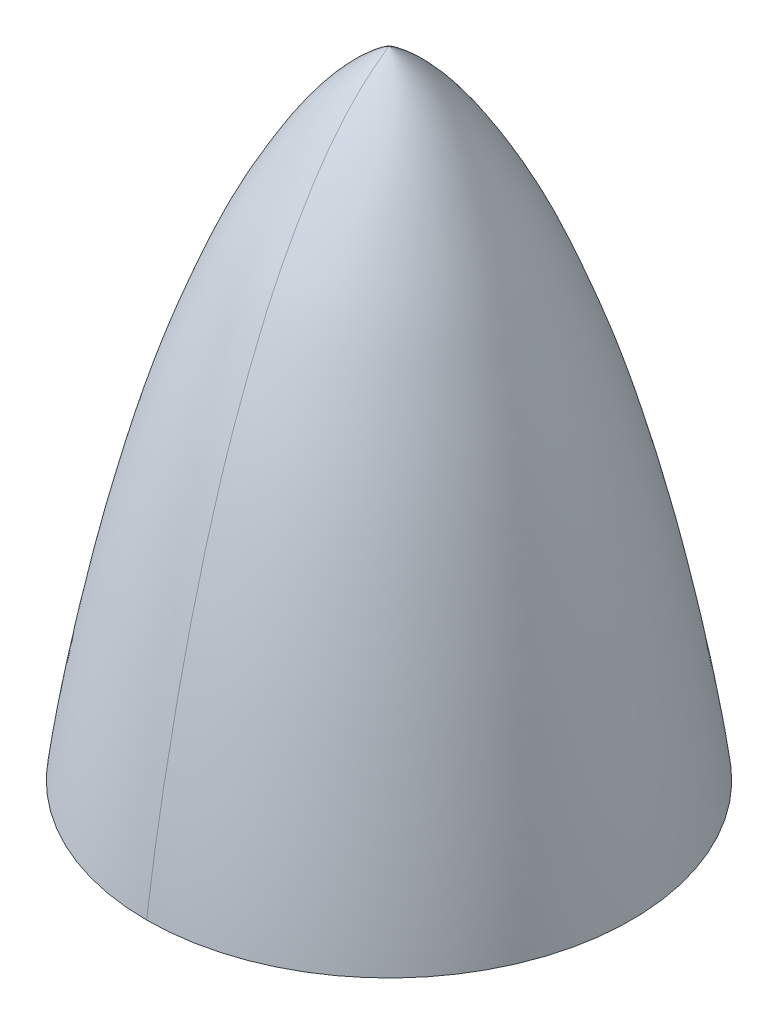
ISO-10303-21;
HEADER;
FILE_DESCRIPTION(('STEP AP214'),'2;1');
FILE_NAME('part.step','',(''),(''),'','','');
FILE_SCHEMA(('AUTOMOTIVE_DESIGN { 1 0 10303 214 1 1 1 1 }'));
ENDSEC;
DATA;
#1=APPLICATION_CONTEXT('core data for automotive mechanical design processes');
#2=APPLICATION_PROTOCOL_DEFINITION('international standard','automotive_design',2000,#1);
#3=PRODUCT_CONTEXT('',#1,'mechanical');
#4=PRODUCT('Part','Part','',(#3));
#5=PRODUCT_RELATED_PRODUCT_CATEGORY('part','',(#4));
#6=PRODUCT_DEFINITION_FORMATION('','',#4);
#7=PRODUCT_DEFINITION_CONTEXT('part definition',#1,'design');
#8=PRODUCT_DEFINITION('design','',#6,#7);
#9=PRODUCT_DEFINITION_SHAPE('','',#8);
#10=(LENGTH_UNIT() NAMED_UNIT(*) SI_UNIT(.MILLI.,.METRE.));
#11=(NAMED_UNIT(*) PLANE_ANGLE_UNIT() SI_UNIT($,.RADIAN.));
#12=(NAMED_UNIT(*) SI_UNIT($,.STERADIAN.) SOLID_ANGLE_UNIT());
#13=UNCERTAINTY_MEASURE_WITH_UNIT(LENGTH_MEASURE(1.E-05),#10,'distance_accuracy_value','');
#14=(GEOMETRIC_REPRESENTATION_CONTEXT(3) GLOBAL_UNCERTAINTY_ASSIGNED_CONTEXT((#13)) GLOBAL_UNIT_ASSIGNED_CONTEXT((#10,
#11,#12)) REPRESENTATION_CONTEXT('',''));
#15=CARTESIAN_POINT('',(0.,0.,0.));
#16=DIRECTION('',(0.,0.,1.));
#17=DIRECTION('',(1.,0.,0.));
#18=AXIS2_PLACEMENT_3D('',#15,#16,#17);
#19=CARTESIAN_POINT('',(0.,663.741999856662,41.2749977111817));
#20=DIRECTION('',(0.,1.,0.));
#21=DIRECTION('',(0.,0.,1.));
#22=AXIS2_PLACEMENT_3D('',#19,#20,#21);
#23=CONICAL_SURFACE('',#22,39.3699932322272,1.57020997915151);
#24=DIRECTION('',(0.,0.000586347609787604,-0.999999828098226));
#25=VECTOR('',#24,1.);
#26=CARTESIAN_POINT('',(0.,663.741999856662,1.90500447895451));
#27=LINE('',#26,#25);
#28=CARTESIAN_POINT('',(0.,663.718915351265,41.2749977111817));
#29=VERTEX_POINT('',#28);
#30=CARTESIAN_POINT('',(0.,663.741999856662,1.90500447895451));
#31=VERTEX_POINT('',#30);
#32=EDGE_CURVE('E32',#29,#31,#27,.T.);
#33=ORIENTED_EDGE('',*,*,#32,.F.);
#34=DIRECTION('',(0.,0.000586347609787604,0.999999828098226));
#35=VECTOR('',#34,1.);
#36=CARTESIAN_POINT('',(0.,663.741999856662,80.6449909434088));
#37=LINE('',#36,#35);
#38=CARTESIAN_POINT('',(0.,663.741999856662,80.6449909434088));
#39=VERTEX_POINT('',#38);
#40=EDGE_CURVE('E61',#29,#39,#37,.T.);
#41=ORIENTED_EDGE('',*,*,#40,.T.);
#42=CARTESIAN_POINT('',(0.,663.741999856662,41.2749977111817));
#43=DIRECTION('',(0.,-1.,0.));
#44=DIRECTION('',(0.,0.,-1.));
#45=AXIS2_PLACEMENT_3D('',#42,#43,#44);
#46=CIRCLE('',#45,39.3699932322272);
#47=EDGE_CURVE('E11',#39,#31,#46,.T.);
#48=ORIENTED_EDGE('',*,*,#47,.T.);
#49=EDGE_LOOP('',(#33,#41,#48));
#50=FACE_BOUND('',#49,.T.);
#51=ADVANCED_FACE('F17',(#50),#23,.T.);
#52=CARTESIAN_POINT('',(0.,663.741999856662,80.6449909434088));
#53=CARTESIAN_POINT('',(-78.7399864644542,663.741999856662,80.6449909434087));
#54=CARTESIAN_POINT('',(-78.7399864644542,663.741999856662,1.90500447895454));
#55=CARTESIAN_POINT('',(0.,663.741999856662,1.90500447895453));
#56=CARTESIAN_POINT('',(0.,672.274081846555,79.5495150284655));
#57=CARTESIAN_POINT('',(-76.5490346345678,672.274081846555,79.5495150284656));
#58=CARTESIAN_POINT('',(-76.5490346345678,672.274081846555,3.00048039389775));
#59=CARTESIAN_POINT('',(0.,672.274081846555,3.00048039389775));
#60=CARTESIAN_POINT('',(0.,683.715125997957,77.4705304733822));
#61=CARTESIAN_POINT('',(-72.391065524401,683.715125997957,77.4705304733822));
#62=CARTESIAN_POINT('',(-72.391065524401,683.715125997957,5.0794649489811));
#63=CARTESIAN_POINT('',(0.,683.715125997957,5.07946494898109));
#64=CARTESIAN_POINT('',(0.,697.722929966956,74.4990738423976));
#65=CARTESIAN_POINT('',(-66.448152262432,697.722929966956,74.4990738423976));
#66=CARTESIAN_POINT('',(-66.448152262432,697.722929966956,8.05092157996565));
#67=CARTESIAN_POINT('',(0.,697.722929966956,8.05092157996565));
#68=CARTESIAN_POINT('',(0.,709.269064542184,71.6733767569119));
#69=CARTESIAN_POINT('',(-60.7967580914604,709.269064542184,71.6733767569118));
#70=CARTESIAN_POINT('',(-60.7967580914604,709.269064542184,10.8766186654514));
#71=CARTESIAN_POINT('',(0.,709.269064542184,10.8766186654514));
#72=CARTESIAN_POINT('',(0.,721.269154813901,68.2980602344515));
#73=CARTESIAN_POINT('',(-54.0461250465397,721.269154813902,68.2980602344515));
#74=CARTESIAN_POINT('',(-54.0461250465397,721.269154813902,14.2519351879118));
#75=CARTESIAN_POINT('',(0.,721.269154813901,14.2519351879118));
#76=CARTESIAN_POINT('',(0.,733.092990878118,63.8801373873335));
#77=CARTESIAN_POINT('',(-45.2102793523038,733.092990878118,63.8801373873336));
#78=CARTESIAN_POINT('',(-45.2102793523038,733.092990878118,18.6698580350298));
#79=CARTESIAN_POINT('',(0.,733.092990878118,18.6698580350298));
#80=CARTESIAN_POINT('',(0.,741.405259678136,60.4832893672495));
#81=CARTESIAN_POINT('',(-38.4165833121356,741.405259678137,60.4832893672495));
#82=CARTESIAN_POINT('',(-38.4165833121356,741.405259678137,22.0667060551138));
#83=CARTESIAN_POINT('',(0.,741.405259678136,22.0667060551138));
#84=CARTESIAN_POINT('',(0.,753.370793332599,54.2087213862572));
#85=CARTESIAN_POINT('',(-25.867447350151,753.370793332598,54.2087213862571));
#86=CARTESIAN_POINT('',(-25.867447350151,753.370793332598,28.3412740361061));
#87=CARTESIAN_POINT('',(0.,753.370793332599,28.3412740361061));
#88=CARTESIAN_POINT('',(0.,762.365061791428,48.2424314959168));
#89=CARTESIAN_POINT('',(-13.9348675694704,762.365061791428,48.2424314959168));
#90=CARTESIAN_POINT('',(-13.9348675694704,762.365061791428,34.3075639264464));
#91=CARTESIAN_POINT('',(0.,762.365061791428,34.3075639264464));
#92=CARTESIAN_POINT('',(0.,767.,41.2749977111817));
#93=CARTESIAN_POINT('',(0.,767.,41.2749977111817));
#94=CARTESIAN_POINT('',(0.,767.,41.2749977111816));
#95=CARTESIAN_POINT('',(0.,767.,41.2749977111817));
#96=(BOUNDED_SURFACE() B_SPLINE_SURFACE(3,3,((#52,#53,#54,#55),(#56,#57,#58,#59),(#60,#61,#62,
#63),(#64,#65,#66,#67),(#68,#69,#70,#71),(#72,#73,#74,#75),(#76,#77,#78,#79),(#80,#81,#82,#83),
(#84,#85,#86,#87),(#88,#89,#90,#91),(#92,#93,#94,#95)),.UNSPECIFIED.,.F.,.F.,
.F.) B_SPLINE_SURFACE_WITH_KNOTS((4,1,1,1,1,1,1,1,4),(4,4),(0.,0.228759558804534,
0.309272631683737,0.380932336521856,0.545032449649137,0.640457782126925,0.716706437735697,
0.783654624598538,1.),(0.,1.),
.UNSPECIFIED.) GEOMETRIC_REPRESENTATION_ITEM() RATIONAL_B_SPLINE_SURFACE(((1.,0.333333333333334,
0.333333333333334,1.),(1.,0.333333333333334,0.333333333333334,1.),(1.,0.333333333333334,
0.333333333333334,1.),(1.,0.333333333333334,0.333333333333334,1.),(1.,0.333333333333334,
0.333333333333334,1.),(1.,0.333333333333334,0.333333333333334,1.),(1.,0.333333333333334,
0.333333333333334,1.),(1.,0.333333333333334,0.333333333333334,1.),(1.,0.333333333333334,
0.333333333333334,1.),(1.,0.333333333333334,0.333333333333334,1.),(1.,0.333333333333334,
0.333333333333334,1.))) REPRESENTATION_ITEM('') SURFACE());
#97=CARTESIAN_POINT('',(0.,663.741999856662,1.90500447895451));
#98=CARTESIAN_POINT('',(0.,672.274081846555,3.00048039389775));
#99=CARTESIAN_POINT('',(0.,683.715125997957,5.07946494898109));
#100=CARTESIAN_POINT('',(0.,697.722929966956,8.05092157996565));
#101=CARTESIAN_POINT('',(0.,709.269064542184,10.8766186654514));
#102=CARTESIAN_POINT('',(0.,721.269154813901,14.2519351879118));
#103=CARTESIAN_POINT('',(0.,733.092990878118,18.6698580350298));
#104=CARTESIAN_POINT('',(0.,741.405259678136,22.0667060551138));
#105=CARTESIAN_POINT('',(0.,753.370793332599,28.3412740361061));
#106=CARTESIAN_POINT('',(0.,762.365061791428,34.3075639264464));
#107=CARTESIAN_POINT('',(0.,767.,41.2749977111817));
#108=(BOUNDED_CURVE() B_SPLINE_CURVE(3,(#97,#98,#99,#100,#101,#102,#103,#104,#105,#106,#107),
.UNSPECIFIED.,.F.,.F.) B_SPLINE_CURVE_WITH_KNOTS((4,1,1,1,1,1,1,1,4),(0.,0.228759558804534,
0.309272631683737,0.380932336521856,0.545032449649137,0.640457782126925,0.716706437735697,
0.783654624598538,1.),
.UNSPECIFIED.) CURVE() GEOMETRIC_REPRESENTATION_ITEM() RATIONAL_B_SPLINE_CURVE((1.,1.,1.,1.,1.,
1.,1.,1.,1.,1.,1.)) REPRESENTATION_ITEM(''));
#109=CARTESIAN_POINT('',(0.,767.,41.2749977111817));
#110=VERTEX_POINT('',#109);
#111=EDGE_CURVE('E23',#31,#110,#108,.T.);
#112=CARTESIAN_POINT('',(0.,663.741999856662,80.6449909434088));
#113=CARTESIAN_POINT('',(0.,672.274081846555,79.5495150284655));
#114=CARTESIAN_POINT('',(0.,683.715125997957,77.4705304733822));
#115=CARTESIAN_POINT('',(0.,697.722929966956,74.4990738423976));
#116=CARTESIAN_POINT('',(0.,709.269064542184,71.6733767569119));
#117=CARTESIAN_POINT('',(0.,721.269154813901,68.2980602344515));
#118=CARTESIAN_POINT('',(0.,733.092990878118,63.8801373873335));
#119=CARTESIAN_POINT('',(0.,741.405259678136,60.4832893672495));
#120=CARTESIAN_POINT('',(0.,753.370793332599,54.2087213862572));
#121=CARTESIAN_POINT('',(0.,762.365061791428,48.2424314959168));
#122=CARTESIAN_POINT('',(0.,767.,41.2749977111817));
#123=(BOUNDED_CURVE() B_SPLINE_CURVE(3,(#112,#113,#114,#115,#116,#117,#118,#119,#120,#121,#122),
.UNSPECIFIED.,.F.,.F.) B_SPLINE_CURVE_WITH_KNOTS((4,1,1,1,1,1,1,1,4),(0.,0.228759558804534,
0.309272631683737,0.380932336521856,0.545032449649137,0.640457782126925,0.716706437735697,
0.783654624598538,1.),
.UNSPECIFIED.) CURVE() GEOMETRIC_REPRESENTATION_ITEM() RATIONAL_B_SPLINE_CURVE((1.,1.,1.,1.,1.,
1.,1.,1.,1.,1.,1.)) REPRESENTATION_ITEM(''));
#124=EDGE_CURVE('E58',#39,#110,#123,.T.);
#125=ORIENTED_EDGE('',*,*,#111,.F.);
#126=ORIENTED_EDGE('',*,*,#47,.F.);
#127=ORIENTED_EDGE('',*,*,#124,.T.);
#128=EDGE_LOOP('',(#125,#126,#127));
#129=FACE_BOUND('',#128,.T.);
#130=ADVANCED_FACE('F19',(#129),#96,.T.);
#131=CARTESIAN_POINT('',(0.,663.741999856662,41.2749977111817));
#132=DIRECTION('',(0.,1.,0.));
#133=DIRECTION('',(0.,0.,1.));
#134=AXIS2_PLACEMENT_3D('',#131,#132,#133);
#135=CONICAL_SURFACE('',#134,39.3699932322272,1.57020997915151);
#136=ORIENTED_EDGE('',*,*,#40,.F.);
#137=ORIENTED_EDGE('',*,*,#32,.T.);
#138=CARTESIAN_POINT('',(0.,663.741999856662,41.2749977111817));
#139=DIRECTION('',(0.,-1.,0.));
#140=DIRECTION('',(0.,0.,-1.));
#141=AXIS2_PLACEMENT_3D('',#138,#139,#140);
#142=CIRCLE('',#141,39.3699932322272);
#143=EDGE_CURVE('E68',#31,#39,#142,.T.);
#144=ORIENTED_EDGE('',*,*,#143,.T.);
#145=EDGE_LOOP('',(#136,#137,#144));
#146=FACE_BOUND('',#145,.T.);
#147=ADVANCED_FACE('F71',(#146),#135,.T.);
#148=CARTESIAN_POINT('',(0.,663.741999856662,1.90500447895453));
#149=CARTESIAN_POINT('',(78.7399864644542,663.741999856662,1.90500447895452));
#150=CARTESIAN_POINT('',(78.7399864644542,663.741999856662,80.6449909434087));
#151=CARTESIAN_POINT('',(0.,663.741999856662,80.6449909434088));
#152=CARTESIAN_POINT('',(0.,672.274081846555,3.00048039389775));
#153=CARTESIAN_POINT('',(76.5490346345678,672.274081846555,3.00048039389774));
#154=CARTESIAN_POINT('',(76.5490346345677,672.274081846555,79.5495150284654));
#155=CARTESIAN_POINT('',(0.,672.274081846555,79.5495150284655));
#156=CARTESIAN_POINT('',(0.,683.715125997957,5.07946494898109));
#157=CARTESIAN_POINT('',(72.391065524401,683.715125997957,5.07946494898108));
#158=CARTESIAN_POINT('',(72.391065524401,683.715125997957,77.4705304733822));
#159=CARTESIAN_POINT('',(0.,683.715125997957,77.4705304733822));
#160=CARTESIAN_POINT('',(0.,697.722929966956,8.05092157996565));
#161=CARTESIAN_POINT('',(66.448152262432,697.722929966956,8.05092157996564));
#162=CARTESIAN_POINT('',(66.448152262432,697.722929966956,74.4990738423976));
#163=CARTESIAN_POINT('',(0.,697.722929966956,74.4990738423976));
#164=CARTESIAN_POINT('',(0.,709.269064542184,10.8766186654514));
#165=CARTESIAN_POINT('',(60.7967580914604,709.269064542184,10.8766186654514));
#166=CARTESIAN_POINT('',(60.7967580914604,709.269064542184,71.6733767569118));
#167=CARTESIAN_POINT('',(0.,709.269064542184,71.6733767569119));
#168=CARTESIAN_POINT('',(0.,721.269154813901,14.2519351879118));
#169=CARTESIAN_POINT('',(54.0461250465397,721.269154813902,14.2519351879118));
#170=CARTESIAN_POINT('',(54.0461250465397,721.269154813902,68.2980602344515));
#171=CARTESIAN_POINT('',(0.,721.269154813901,68.2980602344515));
#172=CARTESIAN_POINT('',(0.,733.092990878118,18.6698580350298));
#173=CARTESIAN_POINT('',(45.2102793523038,733.092990878118,18.6698580350297));
#174=CARTESIAN_POINT('',(45.2102793523038,733.092990878118,63.8801373873336));
#175=CARTESIAN_POINT('',(0.,733.092990878118,63.8801373873335));
#176=CARTESIAN_POINT('',(0.,741.405259678136,22.0667060551138));
#177=CARTESIAN_POINT('',(38.4165833121356,741.405259678137,22.0667060551138));
#178=CARTESIAN_POINT('',(38.4165833121356,741.405259678137,60.4832893672494));
#179=CARTESIAN_POINT('',(0.,741.405259678136,60.4832893672495));
#180=CARTESIAN_POINT('',(0.,753.370793332599,28.3412740361061));
#181=CARTESIAN_POINT('',(25.867447350151,753.370793332598,28.3412740361061));
#182=CARTESIAN_POINT('',(25.867447350151,753.370793332598,54.2087213862571));
#183=CARTESIAN_POINT('',(0.,753.370793332599,54.2087213862572));
#184=CARTESIAN_POINT('',(0.,762.365061791428,34.3075639264464));
#185=CARTESIAN_POINT('',(13.9348675694704,762.365061791428,34.3075639264464));
#186=CARTESIAN_POINT('',(13.9348675694704,762.365061791428,48.2424314959168));
#187=CARTESIAN_POINT('',(0.,762.365061791428,48.2424314959168));
#188=CARTESIAN_POINT('',(0.,767.,41.2749977111817));
#189=CARTESIAN_POINT('',(0.,767.,41.2749977111816));
#190=CARTESIAN_POINT('',(0.,767.,41.2749977111817));
#191=CARTESIAN_POINT('',(0.,767.,41.2749977111817));
#192=(BOUNDED_SURFACE() B_SPLINE_SURFACE(3,3,((#148,#149,#150,#151),(#152,#153,#154,#155),(#156,
#157,#158,#159),(#160,#161,#162,#163),(#164,#165,#166,#167),(#168,#169,#170,#171),(#172,#173,
#174,#175),(#176,#177,#178,#179),(#180,#181,#182,#183),(#184,#185,#186,#187),(#188,#189,#190,
#191)),.UNSPECIFIED.,.F.,.F.,.F.) B_SPLINE_SURFACE_WITH_KNOTS((4,1,1,1,1,1,1,1,4),(4,4),(0.,
0.228759558804534,0.309272631683737,0.380932336521856,0.545032449649137,0.640457782126925,
0.716706437735697,0.783654624598538,1.),(0.,1.),
.UNSPECIFIED.) GEOMETRIC_REPRESENTATION_ITEM() RATIONAL_B_SPLINE_SURFACE(((1.,0.333333333333334,
0.333333333333334,1.),(1.,0.333333333333334,0.333333333333334,1.),(1.,0.333333333333334,
0.333333333333334,1.),(1.,0.333333333333334,0.333333333333334,1.),(1.,0.333333333333334,
0.333333333333334,1.),(1.,0.333333333333334,0.333333333333334,1.),(1.,0.333333333333334,
0.333333333333334,1.),(1.,0.333333333333334,0.333333333333334,1.),(1.,0.333333333333334,
0.333333333333334,1.),(1.,0.333333333333334,0.333333333333334,1.),(1.,0.333333333333334,
0.333333333333334,1.))) REPRESENTATION_ITEM('') SURFACE());
#193=ORIENTED_EDGE('',*,*,#143,.F.);
#194=ORIENTED_EDGE('',*,*,#111,.T.);
#195=ORIENTED_EDGE('',*,*,#124,.F.);
#196=EDGE_LOOP('',(#193,#194,#195));
#197=FACE_BOUND('',#196,.T.);
#198=ADVANCED_FACE('F67',(#197),#192,.T.);
#199=CLOSED_SHELL('',(#51,#130,#147,#198));
#200=MANIFOLD_SOLID_BREP('B1',#199);
#201=ADVANCED_BREP_SHAPE_REPRESENTATION('',(#18,#200),#14);
#202=SHAPE_DEFINITION_REPRESENTATION(#9,#201);
ENDSEC;
END-ISO-10303-21;
